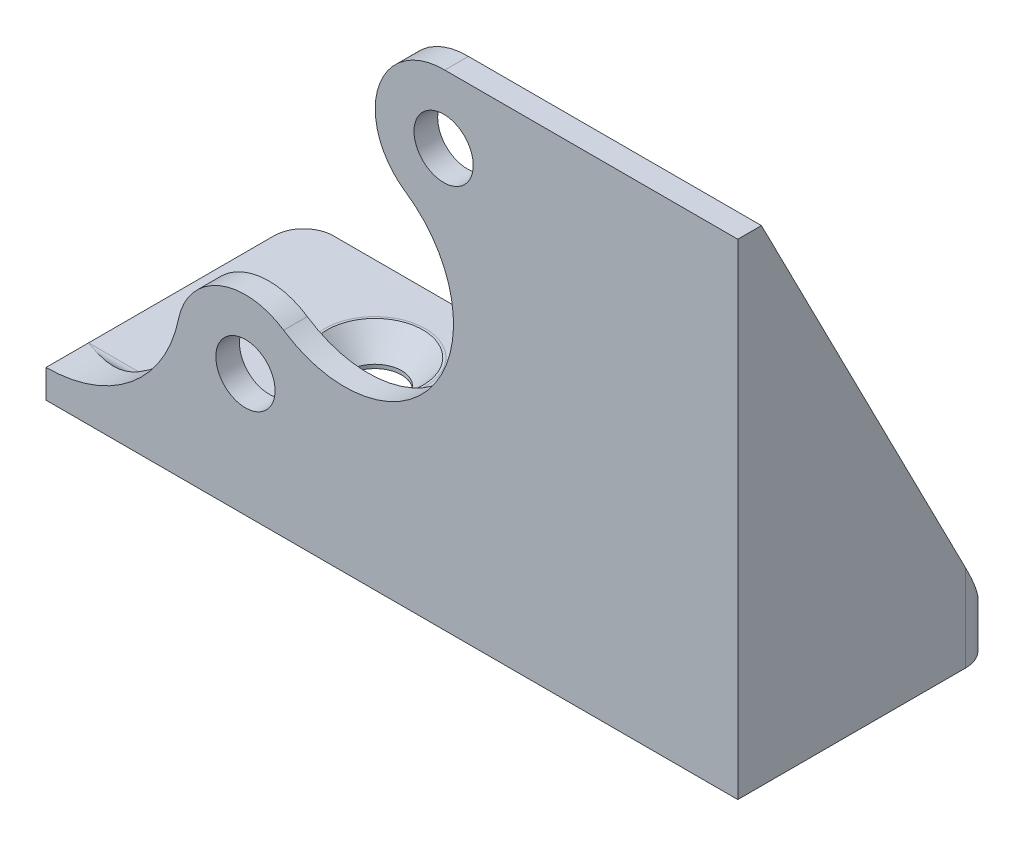
ISO-10303-21;
HEADER;
FILE_DESCRIPTION(('STEP AP214'),'2;1');
FILE_NAME('part.step','',(''),(''),'','','');
FILE_SCHEMA(('AUTOMOTIVE_DESIGN { 1 0 10303 214 1 1 1 1 }'));
ENDSEC;
DATA;
#1=APPLICATION_CONTEXT('core data for automotive mechanical design processes');
#2=APPLICATION_PROTOCOL_DEFINITION('international standard','automotive_design',2000,#1);
#3=PRODUCT_CONTEXT('',#1,'mechanical');
#4=PRODUCT('Part','Part','',(#3));
#5=PRODUCT_RELATED_PRODUCT_CATEGORY('part','',(#4));
#6=PRODUCT_DEFINITION_FORMATION('','',#4);
#7=PRODUCT_DEFINITION_CONTEXT('part definition',#1,'design');
#8=PRODUCT_DEFINITION('design','',#6,#7);
#9=PRODUCT_DEFINITION_SHAPE('','',#8);
#10=(LENGTH_UNIT() NAMED_UNIT(*) SI_UNIT(.MILLI.,.METRE.));
#11=(NAMED_UNIT(*) PLANE_ANGLE_UNIT() SI_UNIT($,.RADIAN.));
#12=(NAMED_UNIT(*) SI_UNIT($,.STERADIAN.) SOLID_ANGLE_UNIT());
#13=UNCERTAINTY_MEASURE_WITH_UNIT(LENGTH_MEASURE(1.E-05),#10,'distance_accuracy_value','');
#14=(GEOMETRIC_REPRESENTATION_CONTEXT(3) GLOBAL_UNCERTAINTY_ASSIGNED_CONTEXT((#13)) GLOBAL_UNIT_ASSIGNED_CONTEXT((#10,
#11,#12)) REPRESENTATION_CONTEXT('',''));
#15=CARTESIAN_POINT('',(0.,0.,0.));
#16=DIRECTION('',(0.,0.,1.));
#17=DIRECTION('',(1.,0.,0.));
#18=AXIS2_PLACEMENT_3D('',#15,#16,#17);
#19=CARTESIAN_POINT('',(130.055584981414,3.81,-3.175));
#20=DIRECTION('',(0.,-1.,0.));
#21=DIRECTION('',(0.,0.,1.));
#22=AXIS2_PLACEMENT_3D('',#19,#20,#21);
#23=PLANE('',#22);
#24=CARTESIAN_POINT('',(25.9680328160001,3.81000000000001,-23.2283000680002));
#25=DIRECTION('',(0.,-1.,0.));
#26=DIRECTION('',(0.,0.,-1.));
#27=AXIS2_PLACEMENT_3D('',#24,#25,#26);
#28=CIRCLE('',#27,6.7437);
#29=CARTESIAN_POINT('',(25.9680328160001,3.81000000000001,-29.9720000680002));
#30=VERTEX_POINT('',#29);
#31=EDGE_CURVE('E136',#30,#30,#28,.F.);
#32=ORIENTED_EDGE('',*,*,#31,.F.);
#33=EDGE_LOOP('',(#32));
#34=FACE_BOUND('',#33,.T.);
#35=DIRECTION('',(-1.,0.,0.));
#36=VECTOR('',#35,1.);
#37=CARTESIAN_POINT('',(91.55684,3.81,-5.715));
#38=LINE('',#37,#36);
#39=CARTESIAN_POINT('',(5.03428,3.81,-5.715));
#40=VERTEX_POINT('',#39);
#41=CARTESIAN_POINT('',(89.01684,3.81,-5.715));
#42=VERTEX_POINT('',#41);
#43=EDGE_CURVE('E331',#40,#42,#38,.F.);
#44=ORIENTED_EDGE('',*,*,#43,.T.);
#45=DIRECTION('',(0.,0.,1.));
#46=VECTOR('',#45,1.);
#47=CARTESIAN_POINT('',(89.01684,3.81,-3.175));
#48=LINE('',#47,#46);
#49=CARTESIAN_POINT('',(89.01684,3.81,-34.5948));
#50=VERTEX_POINT('',#49);
#51=EDGE_CURVE('E334',#42,#50,#48,.F.);
#52=ORIENTED_EDGE('',*,*,#51,.T.);
#53=DIRECTION('',(-1.,0.,0.));
#54=VECTOR('',#53,1.);
#55=CARTESIAN_POINT('',(130.055584981414,3.81,-34.5948));
#56=LINE('',#55,#54);
#57=CARTESIAN_POINT('',(9.03477999999999,3.81,-34.5948));
#58=VERTEX_POINT('',#57);
#59=EDGE_CURVE('E489',#50,#58,#56,.T.);
#60=ORIENTED_EDGE('',*,*,#59,.T.);
#61=CARTESIAN_POINT('',(9.03478,3.81,-30.5943));
#62=DIRECTION('',(0.,1.,0.));
#63=DIRECTION('',(0.,0.,1.));
#64=AXIS2_PLACEMENT_3D('',#61,#62,#63);
#65=CIRCLE('',#64,4.0005);
#66=CARTESIAN_POINT('',(5.03428,3.81,-30.5943));
#67=VERTEX_POINT('',#66);
#68=EDGE_CURVE('E283',#67,#58,#65,.F.);
#69=ORIENTED_EDGE('',*,*,#68,.F.);
#70=DIRECTION('',(0.,0.,-1.));
#71=VECTOR('',#70,1.);
#72=CARTESIAN_POINT('',(5.03428,3.81,-3.175));
#73=LINE('',#72,#71);
#74=EDGE_CURVE('E483',#40,#67,#73,.T.);
#75=ORIENTED_EDGE('',*,*,#74,.F.);
#76=EDGE_LOOP('',(#44,#52,#60,#69,#75));
#77=FACE_BOUND('',#76,.T.);
#78=CARTESIAN_POINT('',(81.8680328160001,3.81000000000001,-23.2283000680001));
#79=DIRECTION('',(0.,-1.,0.));
#80=DIRECTION('',(0.,0.,-1.));
#81=AXIS2_PLACEMENT_3D('',#78,#79,#80);
#82=CIRCLE('',#81,6.74370000000001);
#83=CARTESIAN_POINT('',(81.8680328160001,3.81000000000001,-29.9720000680002));
#84=VERTEX_POINT('',#83);
#85=EDGE_CURVE('E12',#84,#84,#82,.F.);
#86=ORIENTED_EDGE('',*,*,#85,.F.);
#87=EDGE_LOOP('',(#86));
#88=FACE_BOUND('',#87,.T.);
#89=ADVANCED_FACE('F127',(#34,#77,#88),#23,.F.);
#90=CARTESIAN_POINT('',(81.8680328160001,3.81,-23.2283000680001));
#91=DIRECTION('',(0.,1.,0.));
#92=DIRECTION('',(0.,0.,1.));
#93=AXIS2_PLACEMENT_3D('',#90,#91,#92);
#94=CIRCLE('',#93,6.4389);
#95=CARTESIAN_POINT('',(81.8680328160001,3.81,-16.7894000680001));
#96=VERTEX_POINT('',#95);
#97=EDGE_CURVE('E441',#96,#96,#94,.T.);
#98=ORIENTED_EDGE('',*,*,#97,.F.);
#99=EDGE_LOOP('',(#98));
#100=FACE_BOUND('',#99,.T.);
#101=ORIENTED_EDGE('',*,*,#85,.T.);
#102=EDGE_LOOP('',(#101));
#103=FACE_BOUND('',#102,.T.);
#104=ADVANCED_FACE('F387',(#100,#103),#23,.F.);
#105=CARTESIAN_POINT('',(97.90684,0.,3.175));
#106=DIRECTION('',(-1.,0.,0.));
#107=DIRECTION('',(0.,0.,1.));
#108=AXIS2_PLACEMENT_3D('',#105,#106,#107);
#109=PLANE('',#108);
#110=DIRECTION('',(0.,0.,-1.));
#111=VECTOR('',#110,1.);
#112=CARTESIAN_POINT('',(97.90684,65.1525731834804,3.175));
#113=LINE('',#112,#111);
#114=CARTESIAN_POINT('',(97.90684,65.1525731834804,0.));
#115=VERTEX_POINT('',#114);
#116=CARTESIAN_POINT('',(97.90684,65.1525731834804,-3.175));
#117=VERTEX_POINT('',#116);
#118=EDGE_CURVE('E315',#115,#117,#113,.T.);
#119=ORIENTED_EDGE('',*,*,#118,.F.);
#120=DIRECTION('',(0.,-1.,0.));
#121=VECTOR('',#120,1.);
#122=CARTESIAN_POINT('',(97.90684,0.,0.));
#123=LINE('',#122,#121);
#124=CARTESIAN_POINT('',(97.90684,0.,0.));
#125=VERTEX_POINT('',#124);
#126=EDGE_CURVE('E460',#115,#125,#123,.T.);
#127=ORIENTED_EDGE('',*,*,#126,.T.);
#128=DIRECTION('',(0.,0.,-1.));
#129=VECTOR('',#128,1.);
#130=CARTESIAN_POINT('',(97.90684,0.,-3.175));
#131=LINE('',#130,#129);
#132=CARTESIAN_POINT('',(97.90684,0.,-30.5943));
#133=VERTEX_POINT('',#132);
#134=EDGE_CURVE('E294',#125,#133,#131,.T.);
#135=ORIENTED_EDGE('',*,*,#134,.T.);
#136=DIRECTION('',(0.,1.,0.));
#137=VECTOR('',#136,1.);
#138=CARTESIAN_POINT('',(97.90684,0.,-30.5943));
#139=LINE('',#138,#137);
#140=CARTESIAN_POINT('',(97.90684,11.6203923010494,-30.5943));
#141=VERTEX_POINT('',#140);
#142=EDGE_CURVE('E262',#141,#133,#139,.F.);
#143=ORIENTED_EDGE('',*,*,#142,.F.);
#144=DIRECTION('',(0.,-0.890040814248257,-0.455880849534502));
#145=VECTOR('',#144,1.);
#146=CARTESIAN_POINT('',(97.90684,3.81,-34.5948));
#147=LINE('',#146,#145);
#148=EDGE_CURVE('E478',#117,#141,#147,.T.);
#149=ORIENTED_EDGE('',*,*,#148,.F.);
#150=EDGE_LOOP('',(#119,#127,#135,#143,#149));
#151=FACE_BOUND('',#150,.T.);
#152=ADVANCED_FACE('F372',(#151),#109,.F.);
#153=CARTESIAN_POINT('',(0.,0.,3.175));
#154=DIRECTION('',(0.,1.,0.));
#155=DIRECTION('',(0.,0.,1.));
#156=AXIS2_PLACEMENT_3D('',#153,#154,#155);
#157=PLANE('',#156);
#158=CARTESIAN_POINT('',(25.9680328160001,0.,-23.2283000680002));
#159=DIRECTION('',(0.,1.,0.));
#160=DIRECTION('',(0.,0.,1.));
#161=AXIS2_PLACEMENT_3D('',#158,#159,#160);
#162=CIRCLE('',#161,3.57124);
#163=CARTESIAN_POINT('',(25.9680328160001,0.,-19.6570600680002));
#164=VERTEX_POINT('',#163);
#165=EDGE_CURVE('E598',#164,#164,#162,.T.);
#166=ORIENTED_EDGE('',*,*,#165,.T.);
#167=EDGE_LOOP('',(#166));
#168=FACE_BOUND('',#167,.T.);
#169=CARTESIAN_POINT('',(81.8680328160001,0.,-23.2283000680001));
#170=DIRECTION('',(0.,1.,0.));
#171=DIRECTION('',(0.,0.,1.));
#172=AXIS2_PLACEMENT_3D('',#169,#170,#171);
#173=CIRCLE('',#172,3.57124);
#174=CARTESIAN_POINT('',(81.8680328160001,0.,-19.6570600680001));
#175=VERTEX_POINT('',#174);
#176=EDGE_CURVE('E429',#175,#175,#173,.T.);
#177=ORIENTED_EDGE('',*,*,#176,.T.);
#178=EDGE_LOOP('',(#177));
#179=FACE_BOUND('',#178,.T.);
#180=DIRECTION('',(-1.,0.,0.));
#181=VECTOR('',#180,1.);
#182=CARTESIAN_POINT('',(0.,0.,0.));
#183=LINE('',#182,#181);
#184=CARTESIAN_POINT('',(5.03428,0.,0.));
#185=VERTEX_POINT('',#184);
#186=EDGE_CURVE('E457',#125,#185,#183,.T.);
#187=ORIENTED_EDGE('',*,*,#186,.T.);
#188=DIRECTION('',(0.,0.,1.));
#189=VECTOR('',#188,1.);
#190=CARTESIAN_POINT('',(5.03428,0.,-3.175));
#191=LINE('',#190,#189);
#192=CARTESIAN_POINT('',(5.03428,0.,-30.5943));
#193=VERTEX_POINT('',#192);
#194=EDGE_CURVE('E297',#193,#185,#191,.T.);
#195=ORIENTED_EDGE('',*,*,#194,.F.);
#196=CARTESIAN_POINT('',(9.03478000000001,0.,-30.5943));
#197=DIRECTION('',(0.,1.,0.));
#198=DIRECTION('',(0.,0.,1.));
#199=AXIS2_PLACEMENT_3D('',#196,#197,#198);
#200=CIRCLE('',#199,4.0005);
#201=CARTESIAN_POINT('',(9.03478000000001,0.,-34.5948));
#202=VERTEX_POINT('',#201);
#203=EDGE_CURVE('E248',#193,#202,#200,.F.);
#204=ORIENTED_EDGE('',*,*,#203,.T.);
#205=DIRECTION('',(1.,0.,0.));
#206=VECTOR('',#205,1.);
#207=CARTESIAN_POINT('',(9.03478000000001,0.,-34.5948));
#208=LINE('',#207,#206);
#209=CARTESIAN_POINT('',(93.90634,0.,-34.5948));
#210=VERTEX_POINT('',#209);
#211=EDGE_CURVE('E241',#202,#210,#208,.T.);
#212=ORIENTED_EDGE('',*,*,#211,.T.);
#213=CARTESIAN_POINT('',(93.90634,0.,-30.5943));
#214=DIRECTION('',(0.,1.,0.));
#215=DIRECTION('',(0.,0.,1.));
#216=AXIS2_PLACEMENT_3D('',#213,#214,#215);
#217=CIRCLE('',#216,4.0005);
#218=EDGE_CURVE('E245',#210,#133,#217,.F.);
#219=ORIENTED_EDGE('',*,*,#218,.T.);
#220=ORIENTED_EDGE('',*,*,#134,.F.);
#221=EDGE_LOOP('',(#187,#195,#204,#212,#219,#220));
#222=FACE_BOUND('',#221,.T.);
#223=ADVANCED_FACE('F244',(#168,#179,#222),#157,.F.);
#224=CARTESIAN_POINT('',(5.03427999999997,21.9626785235299,3.175));
#225=DIRECTION('',(0.,0.,-1.));
#226=DIRECTION('',(-1.,0.,0.));
#227=AXIS2_PLACEMENT_3D('',#224,#225,#226);
#228=CYLINDRICAL_SURFACE('',#227,18.1526785235299);
#229=CARTESIAN_POINT('',(5.03427999999997,21.9626785235299,0.));
#230=DIRECTION('',(0.,0.,-1.));
#231=DIRECTION('',(-1.,0.,0.));
#232=AXIS2_PLACEMENT_3D('',#229,#230,#231);
#233=CIRCLE('',#232,18.1526785235299);
#234=CARTESIAN_POINT('',(22.8171620588056,18.3172919512674,0.));
#235=VERTEX_POINT('',#234);
#236=CARTESIAN_POINT('',(5.03428,3.81000000000001,0.));
#237=VERTEX_POINT('',#236);
#238=EDGE_CURVE('E454',#235,#237,#233,.T.);
#239=ORIENTED_EDGE('',*,*,#238,.F.);
#240=DIRECTION('',(0.,0.,-1.));
#241=VECTOR('',#240,1.);
#242=CARTESIAN_POINT('',(22.8171620588057,18.3172919512674,3.175));
#243=LINE('',#242,#241);
#244=CARTESIAN_POINT('',(22.8171620588057,18.3172919512674,-3.175));
#245=VERTEX_POINT('',#244);
#246=EDGE_CURVE('E300',#235,#245,#243,.T.);
#247=ORIENTED_EDGE('',*,*,#246,.T.);
#248=CARTESIAN_POINT('',(5.03427999999997,21.9626785235299,-3.175));
#249=DIRECTION('',(0.,0.,-1.));
#250=DIRECTION('',(-1.,0.,0.));
#251=AXIS2_PLACEMENT_3D('',#248,#249,#250);
#252=CIRCLE('',#251,18.1526785235299);
#253=CARTESIAN_POINT('',(14.2951658593297,6.35,-3.175));
#254=VERTEX_POINT('',#253);
#255=EDGE_CURVE('E498',#254,#245,#252,.F.);
#256=ORIENTED_EDGE('',*,*,#255,.F.);
#257=CARTESIAN_POINT('',(14.2951658593297,6.35,-3.175));
#258=CARTESIAN_POINT('',(14.1638877984725,6.2721257410756,-3.17502101212677));
#259=CARTESIAN_POINT('',(14.0316549879577,6.195932925164,-3.17858022726026));
#260=CARTESIAN_POINT('',(13.7656106426947,6.04706393494549,-3.19201782085058));
#261=CARTESIAN_POINT('',(13.6317998171398,5.97438625056062,-3.20189345940558));
#262=CARTESIAN_POINT('',(13.3631144297769,5.83279086236216,-3.22717989178782));
#263=CARTESIAN_POINT('',(13.2282428880417,5.76386517143223,-3.24257835191136));
#264=CARTESIAN_POINT('',(12.9573377207563,5.62965213343949,-3.27829718765417));
#265=CARTESIAN_POINT('',(12.8213039539712,5.56436523603314,-3.29861816991259));
#266=CARTESIAN_POINT('',(12.4130863240878,5.37465036033341,-3.36590241189237));
#267=CARTESIAN_POINT('',(12.1394176940017,5.25564836092218,-3.41932726501573));
#268=CARTESIAN_POINT('',(11.5890404881842,5.03213843951711,-3.53992028384486));
#269=CARTESIAN_POINT('',(11.3123296905323,4.92764199235779,-3.60709922713492));
#270=CARTESIAN_POINT('',(10.7895548740214,4.74455081922718,-3.74380890044606));
#271=CARTESIAN_POINT('',(10.5437301448403,4.66435460314016,-3.81212530820947));
#272=CARTESIAN_POINT('',(10.0507435184162,4.51500854716086,-3.95570099664044));
#273=CARTESIAN_POINT('',(9.80358141672044,4.4458604485942,-4.03096136882324));
#274=CARTESIAN_POINT('',(9.06033940641055,4.25470324042418,-4.2651739771655));
#275=CARTESIAN_POINT('',(8.56261973159364,4.14902157731116,-4.43252613092098));
#276=CARTESIAN_POINT('',(7.56439260204437,3.98004926170486,-4.78094355075765));
#277=CARTESIAN_POINT('',(7.06388265031351,3.9168061948592,-4.96202395782202));
#278=CARTESIAN_POINT('',(6.06201731727119,3.83215491504769,-5.33060452589615));
#279=CARTESIAN_POINT('',(5.56066289828312,3.81071415101195,-5.51809957601497));
#280=CARTESIAN_POINT('',(5.05110556342755,3.81000585089297,-5.70870615587629));
#281=CARTESIAN_POINT('',(5.04269275017341,3.81000000274211,-5.71185309076274));
#282=CARTESIAN_POINT('',(5.03427999999997,3.81,-5.715));
#283=B_SPLINE_CURVE_WITH_KNOTS('',3,(#257,#258,#259,#260,#261,#262,#263,#264,#265,#266,#267,
#268,#269,#270,#271,#272,#273,#274,#275,#276,#277,#278,#279,#280,#281,#282),.UNSPECIFIED.,.F.,
.F.,(4,2,2,2,2,2,2,2,2,2,2,2,4),(0.,0.457807566444149,0.915416682310677,1.37201015300456,
1.82865992177271,2.73731455283293,3.64668394165047,4.44867724413584,5.25079682666519,
6.85541476241622,8.46182893478458,10.0669917067714,10.0939380877672),.UNSPECIFIED.);
#284=EDGE_CURVE('E347',#254,#40,#283,.T.);
#285=ORIENTED_EDGE('',*,*,#284,.T.);
#286=DIRECTION('',(0.,0.,-1.));
#287=VECTOR('',#286,1.);
#288=CARTESIAN_POINT('',(5.03428,3.81000000000001,3.175));
#289=LINE('',#288,#287);
#290=EDGE_CURVE('E151',#237,#40,#289,.T.);
#291=ORIENTED_EDGE('',*,*,#290,.F.);
#292=EDGE_LOOP('',(#239,#247,#256,#285,#291));
#293=FACE_BOUND('',#292,.T.);
#294=ADVANCED_FACE('F361',(#293),#228,.F.);
#295=CARTESIAN_POINT('',(31.8101655818956,16.4737789493269,3.175));
#296=DIRECTION('',(0.,0.,-1.));
#297=DIRECTION('',(-1.,0.,0.));
#298=AXIS2_PLACEMENT_3D('',#295,#296,#297);
#299=CYLINDRICAL_SURFACE('',#298,9.18001375568854);
#300=CARTESIAN_POINT('',(31.8101655818956,16.4737789493269,0.));
#301=DIRECTION('',(0.,0.,-1.));
#302=DIRECTION('',(-1.,0.,0.));
#303=AXIS2_PLACEMENT_3D('',#300,#301,#302);
#304=CIRCLE('',#303,9.18001375568854);
#305=CARTESIAN_POINT('',(36.9386526799485,24.087665777993,0.));
#306=VERTEX_POINT('',#305);
#307=EDGE_CURVE('E475',#306,#235,#304,.F.);
#308=ORIENTED_EDGE('',*,*,#307,.F.);
#309=DIRECTION('',(0.,0.,-1.));
#310=VECTOR('',#309,1.);
#311=CARTESIAN_POINT('',(36.9386526799485,24.087665777993,3.175));
#312=LINE('',#311,#310);
#313=CARTESIAN_POINT('',(36.9386526799485,24.087665777993,-3.175));
#314=VERTEX_POINT('',#313);
#315=EDGE_CURVE('E305',#306,#314,#312,.T.);
#316=ORIENTED_EDGE('',*,*,#315,.T.);
#317=CARTESIAN_POINT('',(31.8101655818956,16.4737789493269,-3.175));
#318=DIRECTION('',(0.,0.,-1.));
#319=DIRECTION('',(-1.,0.,0.));
#320=AXIS2_PLACEMENT_3D('',#317,#318,#319);
#321=CIRCLE('',#320,9.18001375568854);
#322=EDGE_CURVE('E514',#245,#314,#321,.T.);
#323=ORIENTED_EDGE('',*,*,#322,.F.);
#324=ORIENTED_EDGE('',*,*,#246,.F.);
#325=EDGE_LOOP('',(#308,#316,#323,#324));
#326=FACE_BOUND('',#325,.T.);
#327=ADVANCED_FACE('F366',(#326),#299,.T.);
#328=CARTESIAN_POINT('',(45.1132065437581,36.2238234408466,3.175));
#329=DIRECTION('',(0.,0.,-1.));
#330=DIRECTION('',(-1.,0.,0.));
#331=AXIS2_PLACEMENT_3D('',#328,#329,#330);
#332=CYLINDRICAL_SURFACE('',#331,14.6324862443115);
#333=ORIENTED_EDGE('',*,*,#315,.F.);
#334=CARTESIAN_POINT('',(45.1132065437581,36.2238234408466,0.));
#335=DIRECTION('',(0.,0.,-1.));
#336=DIRECTION('',(-1.,0.,0.));
#337=AXIS2_PLACEMENT_3D('',#334,#335,#336);
#338=CIRCLE('',#337,14.6324862443115);
#339=CARTESIAN_POINT('',(53.287760407567,48.3599811037007,0.));
#340=VERTEX_POINT('',#339);
#341=EDGE_CURVE('E471',#306,#340,#338,.F.);
#342=ORIENTED_EDGE('',*,*,#341,.T.);
#343=DIRECTION('',(0.,0.,-1.));
#344=VECTOR('',#343,1.);
#345=CARTESIAN_POINT('',(53.287760407567,48.3599811037007,3.175));
#346=LINE('',#345,#344);
#347=CARTESIAN_POINT('',(53.287760407567,48.3599811037007,-3.175));
#348=VERTEX_POINT('',#347);
#349=EDGE_CURVE('E308',#340,#348,#346,.T.);
#350=ORIENTED_EDGE('',*,*,#349,.T.);
#351=CARTESIAN_POINT('',(45.1132065437581,36.2238234408466,-3.175));
#352=DIRECTION('',(0.,0.,-1.));
#353=DIRECTION('',(-1.,0.,0.));
#354=AXIS2_PLACEMENT_3D('',#351,#352,#353);
#355=CIRCLE('',#354,14.6324862443115);
#356=EDGE_CURVE('E511',#348,#314,#355,.T.);
#357=ORIENTED_EDGE('',*,*,#356,.T.);
#358=EDGE_LOOP('',(#333,#342,#350,#357));
#359=FACE_BOUND('',#358,.T.);
#360=ADVANCED_FACE('F542',(#359),#332,.F.);
#361=CARTESIAN_POINT('',(58.4162475056198,55.9738679323675,3.175));
#362=DIRECTION('',(0.,0.,-1.));
#363=DIRECTION('',(-1.,0.,0.));
#364=AXIS2_PLACEMENT_3D('',#361,#362,#363);
#365=CYLINDRICAL_SURFACE('',#364,9.18001375568909);
#366=CARTESIAN_POINT('',(58.4162475056198,55.9738679323675,0.));
#367=DIRECTION('',(0.,0.,-1.));
#368=DIRECTION('',(-1.,0.,0.));
#369=AXIS2_PLACEMENT_3D('',#366,#367,#368);
#370=CIRCLE('',#369,9.18001375568909);
#371=CARTESIAN_POINT('',(58.5712393371263,65.1525731834804,0.));
#372=VERTEX_POINT('',#371);
#373=EDGE_CURVE('E468',#372,#340,#370,.F.);
#374=ORIENTED_EDGE('',*,*,#373,.F.);
#375=DIRECTION('',(0.,0.,-1.));
#376=VECTOR('',#375,1.);
#377=CARTESIAN_POINT('',(58.5712393371263,65.1525731834804,3.175));
#378=LINE('',#377,#376);
#379=CARTESIAN_POINT('',(58.5712393371263,65.1525731834804,-3.175));
#380=VERTEX_POINT('',#379);
#381=EDGE_CURVE('E311',#372,#380,#378,.T.);
#382=ORIENTED_EDGE('',*,*,#381,.T.);
#383=CARTESIAN_POINT('',(58.4162475056198,55.9738679323675,-3.175));
#384=DIRECTION('',(0.,0.,-1.));
#385=DIRECTION('',(-1.,0.,0.));
#386=AXIS2_PLACEMENT_3D('',#383,#384,#385);
#387=CIRCLE('',#386,9.18001375568909);
#388=EDGE_CURVE('E507',#348,#380,#387,.T.);
#389=ORIENTED_EDGE('',*,*,#388,.F.);
#390=ORIENTED_EDGE('',*,*,#349,.F.);
#391=EDGE_LOOP('',(#374,#382,#389,#390));
#392=FACE_BOUND('',#391,.T.);
#393=ADVANCED_FACE('F538',(#392),#365,.T.);
#394=CARTESIAN_POINT('',(0.,65.1525731834804,3.175));
#395=DIRECTION('',(0.,-1.,0.));
#396=DIRECTION('',(0.,0.,-1.));
#397=AXIS2_PLACEMENT_3D('',#394,#395,#396);
#398=PLANE('',#397);
#399=ORIENTED_EDGE('',*,*,#381,.F.);
#400=DIRECTION('',(1.,0.,0.));
#401=VECTOR('',#400,1.);
#402=CARTESIAN_POINT('',(0.,65.1525731834804,0.));
#403=LINE('',#402,#401);
#404=EDGE_CURVE('E464',#372,#115,#403,.T.);
#405=ORIENTED_EDGE('',*,*,#404,.T.);
#406=ORIENTED_EDGE('',*,*,#118,.T.);
#407=DIRECTION('',(-1.,0.,0.));
#408=VECTOR('',#407,1.);
#409=CARTESIAN_POINT('',(0.,65.1525731834804,-3.175));
#410=LINE('',#409,#408);
#411=CARTESIAN_POINT('',(89.01684,65.1525731834804,-3.175));
#412=VERTEX_POINT('',#411);
#413=EDGE_CURVE('E143',#117,#412,#410,.T.);
#414=ORIENTED_EDGE('',*,*,#413,.T.);
#415=EDGE_CURVE('E504',#412,#380,#410,.T.);
#416=ORIENTED_EDGE('',*,*,#415,.T.);
#417=EDGE_LOOP('',(#399,#405,#406,#414,#416));
#418=FACE_BOUND('',#417,.T.);
#419=ADVANCED_FACE('F534',(#418),#398,.F.);
#420=CARTESIAN_POINT('',(5.03428,0.,3.175));
#421=DIRECTION('',(-1.,0.,0.));
#422=DIRECTION('',(0.,-1.,0.));
#423=AXIS2_PLACEMENT_3D('',#420,#421,#422);
#424=PLANE('',#423);
#425=DIRECTION('',(0.,-1.,0.));
#426=VECTOR('',#425,1.);
#427=CARTESIAN_POINT('',(5.03428,0.,0.));
#428=LINE('',#427,#426);
#429=EDGE_CURVE('E450',#237,#185,#428,.T.);
#430=ORIENTED_EDGE('',*,*,#429,.F.);
#431=ORIENTED_EDGE('',*,*,#290,.T.);
#432=ORIENTED_EDGE('',*,*,#74,.T.);
#433=DIRECTION('',(0.,-1.,0.));
#434=VECTOR('',#433,1.);
#435=CARTESIAN_POINT('',(5.03428,3.81,-30.5943));
#436=LINE('',#435,#434);
#437=EDGE_CURVE('E278',#193,#67,#436,.F.);
#438=ORIENTED_EDGE('',*,*,#437,.F.);
#439=ORIENTED_EDGE('',*,*,#194,.T.);
#440=EDGE_LOOP('',(#430,#431,#432,#438,#439));
#441=FACE_BOUND('',#440,.T.);
#442=ADVANCED_FACE('F368',(#441),#424,.T.);
#443=CARTESIAN_POINT('',(58.4162475056198,55.9738679323675,3.175));
#444=DIRECTION('',(0.,0.,-1.));
#445=DIRECTION('',(-1.,0.,0.));
#446=AXIS2_PLACEMENT_3D('',#443,#444,#445);
#447=CYLINDRICAL_SURFACE('',#446,3.97509999999996);
#448=CARTESIAN_POINT('',(58.4162475056198,55.9738679323675,0.));
#449=DIRECTION('',(0.,0.,-1.));
#450=DIRECTION('',(-1.,0.,0.));
#451=AXIS2_PLACEMENT_3D('',#448,#449,#450);
#452=CIRCLE('',#451,3.97509999999996);
#453=CARTESIAN_POINT('',(54.4411475056198,55.9738679323675,0.));
#454=VERTEX_POINT('',#453);
#455=EDGE_CURVE('E324',#454,#454,#452,.F.);
#456=ORIENTED_EDGE('',*,*,#455,.T.);
#457=EDGE_LOOP('',(#456));
#458=FACE_BOUND('',#457,.T.);
#459=CARTESIAN_POINT('',(58.4162475056198,55.9738679323675,-3.175));
#460=DIRECTION('',(0.,0.,-1.));
#461=DIRECTION('',(-1.,0.,0.));
#462=AXIS2_PLACEMENT_3D('',#459,#460,#461);
#463=CIRCLE('',#462,3.97509999999996);
#464=CARTESIAN_POINT('',(54.4411475056198,55.9738679323675,-3.175));
#465=VERTEX_POINT('',#464);
#466=EDGE_CURVE('E494',#465,#465,#463,.T.);
#467=ORIENTED_EDGE('',*,*,#466,.T.);
#468=EDGE_LOOP('',(#467));
#469=FACE_BOUND('',#468,.T.);
#470=ADVANCED_FACE('F782',(#458,#469),#447,.F.);
#471=CARTESIAN_POINT('',(31.8101655818956,16.4737789493269,3.175));
#472=DIRECTION('',(0.,0.,-1.));
#473=DIRECTION('',(-1.,0.,0.));
#474=AXIS2_PLACEMENT_3D('',#471,#472,#473);
#475=CYLINDRICAL_SURFACE('',#474,3.9751);
#476=CARTESIAN_POINT('',(31.8101655818956,16.4737789493269,0.));
#477=DIRECTION('',(0.,0.,-1.));
#478=DIRECTION('',(-1.,0.,0.));
#479=AXIS2_PLACEMENT_3D('',#476,#477,#478);
#480=CIRCLE('',#479,3.9751);
#481=CARTESIAN_POINT('',(27.8350655818956,16.4737789493269,0.));
#482=VERTEX_POINT('',#481);
#483=EDGE_CURVE('E320',#482,#482,#480,.F.);
#484=ORIENTED_EDGE('',*,*,#483,.T.);
#485=EDGE_LOOP('',(#484));
#486=FACE_BOUND('',#485,.T.);
#487=CARTESIAN_POINT('',(31.8101655818956,16.4737789493269,-3.175));
#488=DIRECTION('',(0.,0.,-1.));
#489=DIRECTION('',(-1.,0.,0.));
#490=AXIS2_PLACEMENT_3D('',#487,#488,#489);
#491=CIRCLE('',#490,3.9751);
#492=CARTESIAN_POINT('',(27.8350655818956,16.4737789493269,-3.175));
#493=VERTEX_POINT('',#492);
#494=EDGE_CURVE('E493',#493,#493,#491,.T.);
#495=ORIENTED_EDGE('',*,*,#494,.T.);
#496=EDGE_LOOP('',(#495));
#497=FACE_BOUND('',#496,.T.);
#498=ADVANCED_FACE('F753',(#486,#497),#475,.F.);
#499=CARTESIAN_POINT('',(130.055584981414,-2.9972,-34.5948));
#500=DIRECTION('',(0.,0.,1.));
#501=DIRECTION('',(-1.,0.,0.));
#502=AXIS2_PLACEMENT_3D('',#499,#500,#501);
#503=PLANE('',#502);
#504=DIRECTION('',(0.,1.,0.));
#505=VECTOR('',#504,1.);
#506=CARTESIAN_POINT('',(93.90634,-2.9972,-34.5948));
#507=LINE('',#506,#505);
#508=CARTESIAN_POINT('',(93.90634,0.00279999999999942,-34.5948));
#509=VERTEX_POINT('',#508);
#510=EDGE_CURVE('E259',#210,#509,#507,.T.);
#511=ORIENTED_EDGE('',*,*,#510,.F.);
#512=ORIENTED_EDGE('',*,*,#211,.F.);
#513=DIRECTION('',(0.,-1.,0.));
#514=VECTOR('',#513,1.);
#515=CARTESIAN_POINT('',(9.03478000000001,-2.9972,-34.5948));
#516=LINE('',#515,#514);
#517=CARTESIAN_POINT('',(9.03478,0.00279999999999942,-34.5948));
#518=VERTEX_POINT('',#517);
#519=EDGE_CURVE('E271',#518,#202,#516,.T.);
#520=ORIENTED_EDGE('',*,*,#519,.F.);
#521=DIRECTION('',(1.,0.,0.));
#522=VECTOR('',#521,1.);
#523=CARTESIAN_POINT('',(130.055584981414,0.00279999999999942,-34.5948));
#524=LINE('',#523,#522);
#525=EDGE_CURVE('E269',#518,#509,#524,.T.);
#526=ORIENTED_EDGE('',*,*,#525,.T.);
#527=EDGE_LOOP('',(#511,#512,#520,#526));
#528=FACE_BOUND('',#527,.T.);
#529=ADVANCED_FACE('F267',(#528),#503,.F.);
#530=CARTESIAN_POINT('',(0.,0.,-3.175));
#531=DIRECTION('',(0.,0.,1.));
#532=DIRECTION('',(-1.,0.,0.));
#533=AXIS2_PLACEMENT_3D('',#530,#531,#532);
#534=PLANE('',#533);
#535=ORIENTED_EDGE('',*,*,#466,.F.);
#536=EDGE_LOOP('',(#535));
#537=FACE_BOUND('',#536,.T.);
#538=ORIENTED_EDGE('',*,*,#494,.F.);
#539=EDGE_LOOP('',(#538));
#540=FACE_BOUND('',#539,.T.);
#541=DIRECTION('',(0.,1.,0.));
#542=VECTOR('',#541,1.);
#543=CARTESIAN_POINT('',(89.01684,0.,-3.175));
#544=LINE('',#543,#542);
#545=CARTESIAN_POINT('',(89.01684,6.35,-3.175));
#546=VERTEX_POINT('',#545);
#547=EDGE_CURVE('E338',#412,#546,#544,.F.);
#548=ORIENTED_EDGE('',*,*,#547,.T.);
#549=DIRECTION('',(-1.,0.,0.));
#550=VECTOR('',#549,1.);
#551=CARTESIAN_POINT('',(5.03428,6.35,-3.175));
#552=LINE('',#551,#550);
#553=EDGE_CURVE('E341',#546,#254,#552,.T.);
#554=ORIENTED_EDGE('',*,*,#553,.T.);
#555=ORIENTED_EDGE('',*,*,#255,.T.);
#556=ORIENTED_EDGE('',*,*,#322,.T.);
#557=ORIENTED_EDGE('',*,*,#356,.F.);
#558=ORIENTED_EDGE('',*,*,#388,.T.);
#559=ORIENTED_EDGE('',*,*,#415,.F.);
#560=EDGE_LOOP('',(#548,#554,#555,#556,#557,#558,#559));
#561=FACE_BOUND('',#560,.T.);
#562=ADVANCED_FACE('F410',(#537,#540,#561),#534,.F.);
#563=EDGE_CURVE('E276',#58,#518,#516,.T.);
#564=ORIENTED_EDGE('',*,*,#563,.F.);
#565=ORIENTED_EDGE('',*,*,#59,.F.);
#566=CARTESIAN_POINT('',(93.90634,3.81,-34.5948));
#567=VERTEX_POINT('',#566);
#568=EDGE_CURVE('E490',#567,#50,#56,.T.);
#569=ORIENTED_EDGE('',*,*,#568,.F.);
#570=EDGE_CURVE('E272',#509,#567,#507,.T.);
#571=ORIENTED_EDGE('',*,*,#570,.F.);
#572=ORIENTED_EDGE('',*,*,#525,.F.);
#573=EDGE_LOOP('',(#564,#565,#569,#571,#572));
#574=FACE_BOUND('',#573,.T.);
#575=ADVANCED_FACE('F401',(#574),#503,.F.);
#576=CARTESIAN_POINT('',(25.9680328160001,3.81,-23.2283000680002));
#577=DIRECTION('',(0.,1.,0.));
#578=DIRECTION('',(0.,0.,1.));
#579=AXIS2_PLACEMENT_3D('',#576,#577,#578);
#580=CIRCLE('',#579,6.4389);
#581=CARTESIAN_POINT('',(25.9680328160001,3.81,-16.7894000680002));
#582=VERTEX_POINT('',#581);
#583=EDGE_CURVE('E415',#582,#582,#580,.T.);
#584=ORIENTED_EDGE('',*,*,#583,.F.);
#585=EDGE_LOOP('',(#584));
#586=FACE_BOUND('',#585,.T.);
#587=ORIENTED_EDGE('',*,*,#31,.T.);
#588=EDGE_LOOP('',(#587));
#589=FACE_BOUND('',#588,.T.);
#590=ADVANCED_FACE('F390',(#586,#589),#23,.F.);
#591=CARTESIAN_POINT('',(91.55684,3.81,-34.5948));
#592=DIRECTION('',(0.,0.455880849534502,-0.890040814248257));
#593=DIRECTION('',(0.,-0.890040814248257,-0.455880849534502));
#594=AXIS2_PLACEMENT_3D('',#591,#592,#593);
#595=PLANE('',#594);
#596=ORIENTED_EDGE('',*,*,#568,.T.);
#597=CARTESIAN_POINT('',(89.01684,6.35,-33.2938064508495));
#598=DIRECTION('',(0.,0.455880849534502,-0.890040814248257));
#599=DIRECTION('',(0.,0.890040814248257,0.455880849534502));
#600=AXIS2_PLACEMENT_3D('',#597,#598,#599);
#601=ELLIPSE('',#600,2.85380171261621,2.54);
#602=CARTESIAN_POINT('',(91.55684,6.35,-33.2938064508495));
#603=VERTEX_POINT('',#602);
#604=EDGE_CURVE('E344',#50,#603,#601,.F.);
#605=ORIENTED_EDGE('',*,*,#604,.T.);
#606=DIRECTION('',(0.,-0.890040814248257,-0.455880849534502));
#607=VECTOR('',#606,1.);
#608=CARTESIAN_POINT('',(91.55684,3.81,-34.5948));
#609=LINE('',#608,#607);
#610=CARTESIAN_POINT('',(91.55684,60.1935939447189,-5.71499999999999));
#611=VERTEX_POINT('',#610);
#612=EDGE_CURVE('E479',#611,#603,#609,.T.);
#613=ORIENTED_EDGE('',*,*,#612,.F.);
#614=CARTESIAN_POINT('',(89.01684,60.1935939447188,-5.715));
#615=DIRECTION('',(0.,0.455880849534502,-0.890040814248257));
#616=DIRECTION('',(0.,0.890040814248257,0.455880849534502));
#617=AXIS2_PLACEMENT_3D('',#614,#615,#616);
#618=ELLIPSE('',#617,5.57163127732517,2.54);
#619=EDGE_CURVE('E356',#611,#412,#618,.F.);
#620=ORIENTED_EDGE('',*,*,#619,.T.);
#621=ORIENTED_EDGE('',*,*,#413,.F.);
#622=ORIENTED_EDGE('',*,*,#148,.T.);
#623=CARTESIAN_POINT('',(93.90634,11.6203923010494,-30.5943));
#624=DIRECTION('',(0.,-0.455880849534502,0.890040814248257));
#625=DIRECTION('',(0.,0.890040814248257,0.455880849534502));
#626=AXIS2_PLACEMENT_3D('',#623,#624,#625);
#627=ELLIPSE('',#626,8.77531926178714,4.0005);
#628=EDGE_CURVE('E287',#567,#141,#627,.T.);
#629=ORIENTED_EDGE('',*,*,#628,.F.);
#630=EDGE_LOOP('',(#596,#605,#613,#620,#621,#622,#629));
#631=FACE_BOUND('',#630,.T.);
#632=ADVANCED_FACE('F400',(#631),#595,.T.);
#633=CARTESIAN_POINT('',(91.55684,0.,0.));
#634=DIRECTION('',(-1.,0.,0.));
#635=DIRECTION('',(0.,0.,-1.));
#636=AXIS2_PLACEMENT_3D('',#633,#634,#635);
#637=PLANE('',#636);
#638=ORIENTED_EDGE('',*,*,#612,.T.);
#639=DIRECTION('',(0.,0.,1.));
#640=VECTOR('',#639,1.);
#641=CARTESIAN_POINT('',(91.55684,6.35,0.));
#642=LINE('',#641,#640);
#643=CARTESIAN_POINT('',(91.55684,6.35,-5.715));
#644=VERTEX_POINT('',#643);
#645=EDGE_CURVE('E327',#603,#644,#642,.T.);
#646=ORIENTED_EDGE('',*,*,#645,.T.);
#647=DIRECTION('',(0.,1.,0.));
#648=VECTOR('',#647,1.);
#649=CARTESIAN_POINT('',(91.55684,0.,-5.715));
#650=LINE('',#649,#648);
#651=EDGE_CURVE('E304',#644,#611,#650,.T.);
#652=ORIENTED_EDGE('',*,*,#651,.T.);
#653=EDGE_LOOP('',(#638,#646,#652));
#654=FACE_BOUND('',#653,.T.);
#655=ADVANCED_FACE('F407',(#654),#637,.T.);
#656=CARTESIAN_POINT('',(9.03478000000001,-2.99720000000011,-30.5943));
#657=DIRECTION('',(0.,1.,0.));
#658=DIRECTION('',(-1.,0.,0.));
#659=AXIS2_PLACEMENT_3D('',#656,#657,#658);
#660=CYLINDRICAL_SURFACE('',#659,4.0005);
#661=ORIENTED_EDGE('',*,*,#203,.F.);
#662=ORIENTED_EDGE('',*,*,#437,.T.);
#663=ORIENTED_EDGE('',*,*,#68,.T.);
#664=ORIENTED_EDGE('',*,*,#563,.T.);
#665=ORIENTED_EDGE('',*,*,#519,.T.);
#666=EDGE_LOOP('',(#661,#662,#663,#664,#665));
#667=FACE_BOUND('',#666,.T.);
#668=ADVANCED_FACE('F524',(#667),#660,.T.);
#669=CARTESIAN_POINT('',(93.90634,-2.9972,-30.5943));
#670=DIRECTION('',(0.,1.,0.));
#671=DIRECTION('',(0.,0.,-1.));
#672=AXIS2_PLACEMENT_3D('',#669,#670,#671);
#673=CYLINDRICAL_SURFACE('',#672,4.0005);
#674=ORIENTED_EDGE('',*,*,#218,.F.);
#675=ORIENTED_EDGE('',*,*,#510,.T.);
#676=ORIENTED_EDGE('',*,*,#570,.T.);
#677=ORIENTED_EDGE('',*,*,#628,.T.);
#678=ORIENTED_EDGE('',*,*,#142,.T.);
#679=EDGE_LOOP('',(#674,#675,#676,#677,#678));
#680=FACE_BOUND('',#679,.T.);
#681=ADVANCED_FACE('F257',(#680),#673,.T.);
#682=CARTESIAN_POINT('',(0.,0.,0.));
#683=DIRECTION('',(0.,0.,-1.));
#684=DIRECTION('',(-1.,0.,0.));
#685=AXIS2_PLACEMENT_3D('',#682,#683,#684);
#686=PLANE('',#685);
#687=ORIENTED_EDGE('',*,*,#307,.T.);
#688=ORIENTED_EDGE('',*,*,#238,.T.);
#689=ORIENTED_EDGE('',*,*,#429,.T.);
#690=ORIENTED_EDGE('',*,*,#186,.F.);
#691=ORIENTED_EDGE('',*,*,#126,.F.);
#692=ORIENTED_EDGE('',*,*,#404,.F.);
#693=ORIENTED_EDGE('',*,*,#373,.T.);
#694=ORIENTED_EDGE('',*,*,#341,.F.);
#695=EDGE_LOOP('',(#687,#688,#689,#690,#691,#692,#693,#694));
#696=FACE_BOUND('',#695,.T.);
#697=ORIENTED_EDGE('',*,*,#483,.F.);
#698=EDGE_LOOP('',(#697));
#699=FACE_BOUND('',#698,.T.);
#700=ORIENTED_EDGE('',*,*,#455,.F.);
#701=EDGE_LOOP('',(#700));
#702=FACE_BOUND('',#701,.T.);
#703=ADVANCED_FACE('F545',(#696,#699,#702),#686,.F.);
#704=CARTESIAN_POINT('',(89.01684,0.,-5.715));
#705=DIRECTION('',(0.,1.,0.));
#706=DIRECTION('',(0.,0.,1.));
#707=AXIS2_PLACEMENT_3D('',#704,#705,#706);
#708=CYLINDRICAL_SURFACE('',#707,2.54);
#709=ORIENTED_EDGE('',*,*,#619,.F.);
#710=ORIENTED_EDGE('',*,*,#651,.F.);
#711=CARTESIAN_POINT('',(89.01684,6.35,-5.715));
#712=DIRECTION('',(0.,1.,0.));
#713=DIRECTION('',(0.,0.,1.));
#714=AXIS2_PLACEMENT_3D('',#711,#712,#713);
#715=CIRCLE('',#714,2.54);
#716=EDGE_CURVE('E254',#546,#644,#715,.T.);
#717=ORIENTED_EDGE('',*,*,#716,.F.);
#718=ORIENTED_EDGE('',*,*,#547,.F.);
#719=EDGE_LOOP('',(#709,#710,#717,#718));
#720=FACE_BOUND('',#719,.T.);
#721=ADVANCED_FACE('F129',(#720),#708,.F.);
#722=CARTESIAN_POINT('',(0.,6.35,-5.715));
#723=DIRECTION('',(1.,0.,0.));
#724=DIRECTION('',(0.,0.,-1.));
#725=AXIS2_PLACEMENT_3D('',#722,#723,#724);
#726=CYLINDRICAL_SURFACE('',#725,2.54);
#727=ORIENTED_EDGE('',*,*,#284,.F.);
#728=ORIENTED_EDGE('',*,*,#553,.F.);
#729=CARTESIAN_POINT('',(89.01684,6.35,-5.715));
#730=DIRECTION('',(-1.,0.,0.));
#731=DIRECTION('',(0.,0.,1.));
#732=AXIS2_PLACEMENT_3D('',#729,#730,#731);
#733=CIRCLE('',#732,2.54);
#734=EDGE_CURVE('E425',#42,#546,#733,.T.);
#735=ORIENTED_EDGE('',*,*,#734,.F.);
#736=ORIENTED_EDGE('',*,*,#43,.F.);
#737=EDGE_LOOP('',(#727,#728,#735,#736));
#738=FACE_BOUND('',#737,.T.);
#739=ADVANCED_FACE('F358',(#738),#726,.F.);
#740=CARTESIAN_POINT('',(89.01684,6.35,-5.715));
#741=DIRECTION('',(0.,0.,1.));
#742=DIRECTION('',(1.,0.,0.));
#743=AXIS2_PLACEMENT_3D('',#740,#741,#742);
#744=SPHERICAL_SURFACE('',#743,2.54);
#745=ORIENTED_EDGE('',*,*,#734,.T.);
#746=ORIENTED_EDGE('',*,*,#716,.T.);
#747=CARTESIAN_POINT('',(89.01684,6.35,-5.715));
#748=DIRECTION('',(0.,0.,-1.));
#749=DIRECTION('',(-1.,0.,0.));
#750=AXIS2_PLACEMENT_3D('',#747,#748,#749);
#751=CIRCLE('',#750,2.54);
#752=EDGE_CURVE('E427',#42,#644,#751,.F.);
#753=ORIENTED_EDGE('',*,*,#752,.F.);
#754=EDGE_LOOP('',(#745,#746,#753));
#755=FACE_BOUND('',#754,.T.);
#756=ADVANCED_FACE('F377',(#755),#744,.F.);
#757=CARTESIAN_POINT('',(89.01684,6.35,0.));
#758=DIRECTION('',(0.,0.,1.));
#759=DIRECTION('',(0.,-1.,0.));
#760=AXIS2_PLACEMENT_3D('',#757,#758,#759);
#761=CYLINDRICAL_SURFACE('',#760,2.54);
#762=ORIENTED_EDGE('',*,*,#604,.F.);
#763=ORIENTED_EDGE('',*,*,#51,.F.);
#764=ORIENTED_EDGE('',*,*,#752,.T.);
#765=ORIENTED_EDGE('',*,*,#645,.F.);
#766=EDGE_LOOP('',(#762,#763,#764,#765));
#767=FACE_BOUND('',#766,.T.);
#768=ADVANCED_FACE('F374',(#767),#761,.F.);
#769=CARTESIAN_POINT('',(81.8680328160001,3.81,-23.2283000680001));
#770=DIRECTION('',(0.,1.,0.));
#771=DIRECTION('',(0.,0.,1.));
#772=AXIS2_PLACEMENT_3D('',#769,#770,#771);
#773=CYLINDRICAL_SURFACE('',#772,3.57124);
#774=ORIENTED_EDGE('',*,*,#176,.F.);
#775=EDGE_LOOP('',(#774));
#776=FACE_BOUND('',#775,.T.);
#777=CARTESIAN_POINT('',(81.8680328160001,0.511134533348609,-23.2283000680001));
#778=DIRECTION('',(0.,1.,0.));
#779=DIRECTION('',(0.,0.,1.));
#780=AXIS2_PLACEMENT_3D('',#777,#778,#779);
#781=CIRCLE('',#780,3.57124);
#782=CARTESIAN_POINT('',(81.8680328160001,0.51113453334861,-19.6570600680001));
#783=VERTEX_POINT('',#782);
#784=EDGE_CURVE('E435',#783,#783,#781,.T.);
#785=ORIENTED_EDGE('',*,*,#784,.T.);
#786=EDGE_LOOP('',(#785));
#787=FACE_BOUND('',#786,.T.);
#788=ADVANCED_FACE('F376',(#776,#787),#773,.F.);
#789=CARTESIAN_POINT('',(81.8680328160001,3.81,-23.2283000680001));
#790=DIRECTION('',(0.,1.,0.));
#791=DIRECTION('',(0.,0.,1.));
#792=AXIS2_PLACEMENT_3D('',#789,#790,#791);
#793=CONICAL_SURFACE('',#792,6.4389,0.715584993317675);
#794=ORIENTED_EDGE('',*,*,#784,.F.);
#795=EDGE_LOOP('',(#794));
#796=FACE_BOUND('',#795,.T.);
#797=ORIENTED_EDGE('',*,*,#97,.T.);
#798=EDGE_LOOP('',(#797));
#799=FACE_BOUND('',#798,.T.);
#800=ADVANCED_FACE('F577',(#796,#799),#793,.F.);
#801=CARTESIAN_POINT('',(25.9680328160001,3.81,-23.2283000680002));
#802=DIRECTION('',(0.,1.,0.));
#803=DIRECTION('',(0.,0.,1.));
#804=AXIS2_PLACEMENT_3D('',#801,#802,#803);
#805=CYLINDRICAL_SURFACE('',#804,3.57124);
#806=ORIENTED_EDGE('',*,*,#165,.F.);
#807=EDGE_LOOP('',(#806));
#808=FACE_BOUND('',#807,.T.);
#809=CARTESIAN_POINT('',(25.9680328160001,0.511134533348609,-23.2283000680002));
#810=DIRECTION('',(0.,1.,0.));
#811=DIRECTION('',(0.,0.,1.));
#812=AXIS2_PLACEMENT_3D('',#809,#810,#811);
#813=CIRCLE('',#812,3.57124);
#814=CARTESIAN_POINT('',(25.9680328160001,0.51113453334861,-19.6570600680002));
#815=VERTEX_POINT('',#814);
#816=EDGE_CURVE('E594',#815,#815,#813,.T.);
#817=ORIENTED_EDGE('',*,*,#816,.T.);
#818=EDGE_LOOP('',(#817));
#819=FACE_BOUND('',#818,.T.);
#820=ADVANCED_FACE('F581',(#808,#819),#805,.F.);
#821=CARTESIAN_POINT('',(25.9680328160001,3.81,-23.2283000680002));
#822=DIRECTION('',(0.,1.,0.));
#823=DIRECTION('',(0.,0.,1.));
#824=AXIS2_PLACEMENT_3D('',#821,#822,#823);
#825=CONICAL_SURFACE('',#824,6.4389,0.715584993317676);
#826=ORIENTED_EDGE('',*,*,#816,.F.);
#827=EDGE_LOOP('',(#826));
#828=FACE_BOUND('',#827,.T.);
#829=ORIENTED_EDGE('',*,*,#583,.T.);
#830=EDGE_LOOP('',(#829));
#831=FACE_BOUND('',#830,.T.);
#832=ADVANCED_FACE('F585',(#828,#831),#825,.F.);
#833=CLOSED_SHELL('',(#89,#104,#152,#223,#294,#327,#360,#393,#419,#442,#470,#498,#529,#562,#575,
#590,#632,#655,#668,#681,#703,#721,#739,#756,#768,#788,#800,#820,#832));
#834=MANIFOLD_SOLID_BREP('B2',#833);
#835=ADVANCED_BREP_SHAPE_REPRESENTATION('',(#18,#834),#14);
#836=SHAPE_DEFINITION_REPRESENTATION(#9,#835);
ENDSEC;
END-ISO-10303-21;
